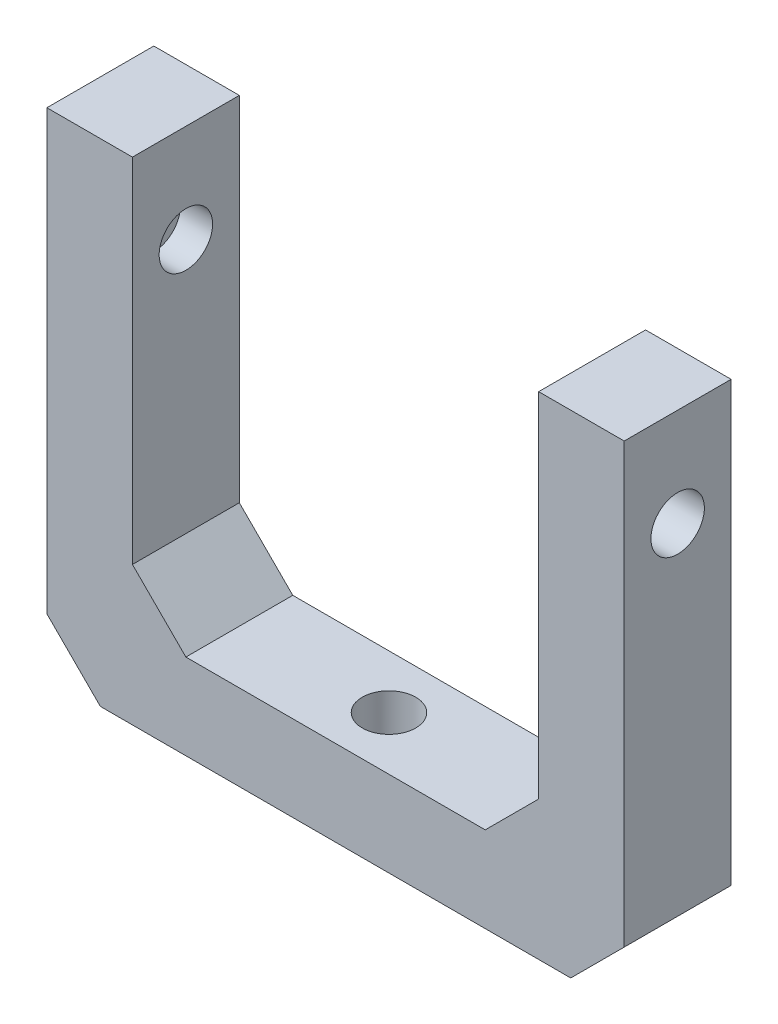
ISO-10303-21;
HEADER;
FILE_DESCRIPTION(('STEP AP214'),'2;1');
FILE_NAME('part.step','',(''),(''),'','','');
FILE_SCHEMA(('AUTOMOTIVE_DESIGN { 1 0 10303 214 1 1 1 1 }'));
ENDSEC;
DATA;
#1=APPLICATION_CONTEXT('core data for automotive mechanical design processes');
#2=APPLICATION_PROTOCOL_DEFINITION('international standard','automotive_design',2000,#1);
#3=PRODUCT_CONTEXT('',#1,'mechanical');
#4=PRODUCT('Part','Part','',(#3));
#5=PRODUCT_RELATED_PRODUCT_CATEGORY('part','',(#4));
#6=PRODUCT_DEFINITION_FORMATION('','',#4);
#7=PRODUCT_DEFINITION_CONTEXT('part definition',#1,'design');
#8=PRODUCT_DEFINITION('design','',#6,#7);
#9=PRODUCT_DEFINITION_SHAPE('','',#8);
#10=(LENGTH_UNIT() NAMED_UNIT(*) SI_UNIT(.MILLI.,.METRE.));
#11=(NAMED_UNIT(*) PLANE_ANGLE_UNIT() SI_UNIT($,.RADIAN.));
#12=(NAMED_UNIT(*) SI_UNIT($,.STERADIAN.) SOLID_ANGLE_UNIT());
#13=UNCERTAINTY_MEASURE_WITH_UNIT(LENGTH_MEASURE(1.E-05),#10,'distance_accuracy_value','');
#14=(GEOMETRIC_REPRESENTATION_CONTEXT(3) GLOBAL_UNCERTAINTY_ASSIGNED_CONTEXT((#13)) GLOBAL_UNIT_ASSIGNED_CONTEXT((#10,
#11,#12)) REPRESENTATION_CONTEXT('',''));
#15=CARTESIAN_POINT('',(0.,0.,0.));
#16=DIRECTION('',(0.,0.,1.));
#17=DIRECTION('',(1.,0.,0.));
#18=AXIS2_PLACEMENT_3D('',#15,#16,#17);
#19=CARTESIAN_POINT('',(0.,38.001,5.));
#20=DIRECTION('',(0.,-1.,0.));
#21=DIRECTION('',(1.,0.,0.));
#22=AXIS2_PLACEMENT_3D('',#19,#20,#21);
#23=CYLINDRICAL_SURFACE('',#22,2.5);
#24=CARTESIAN_POINT('',(0.,0.,5.));
#25=DIRECTION('',(0.,-1.,0.));
#26=DIRECTION('',(0.,0.,-1.));
#27=AXIS2_PLACEMENT_3D('',#24,#25,#26);
#28=CIRCLE('',#27,2.5);
#29=CARTESIAN_POINT('',(0.,0.,2.5));
#30=VERTEX_POINT('',#29);
#31=EDGE_CURVE('E235',#30,#30,#28,.F.);
#32=ORIENTED_EDGE('',*,*,#31,.T.);
#33=EDGE_LOOP('',(#32));
#34=FACE_BOUND('',#33,.T.);
#35=CARTESIAN_POINT('',(0.,-4.,5.));
#36=DIRECTION('',(0.,-1.,0.));
#37=DIRECTION('',(1.,0.,0.));
#38=AXIS2_PLACEMENT_3D('',#35,#36,#37);
#39=CIRCLE('',#38,2.5);
#40=CARTESIAN_POINT('',(2.5,-4.,5.));
#41=VERTEX_POINT('',#40);
#42=EDGE_CURVE('E48',#41,#41,#39,.F.);
#43=ORIENTED_EDGE('',*,*,#42,.F.);
#44=EDGE_LOOP('',(#43));
#45=FACE_BOUND('',#44,.T.);
#46=ADVANCED_FACE('F44',(#34,#45),#23,.F.);
#47=CARTESIAN_POINT('',(27.001,28.83,5.));
#48=DIRECTION('',(-1.,0.,0.));
#49=DIRECTION('',(0.,-1.,0.));
#50=AXIS2_PLACEMENT_3D('',#47,#48,#49);
#51=CYLINDRICAL_SURFACE('',#50,2.5);
#52=CARTESIAN_POINT('',(27.,28.83,5.));
#53=DIRECTION('',(-1.,0.,0.));
#54=DIRECTION('',(0.,-1.,0.));
#55=AXIS2_PLACEMENT_3D('',#52,#53,#54);
#56=CIRCLE('',#55,2.5);
#57=CARTESIAN_POINT('',(27.,26.33,5.));
#58=VERTEX_POINT('',#57);
#59=EDGE_CURVE('E282',#58,#58,#56,.T.);
#60=ORIENTED_EDGE('',*,*,#59,.F.);
#61=EDGE_LOOP('',(#60));
#62=FACE_BOUND('',#61,.T.);
#63=CARTESIAN_POINT('',(22.,28.83,5.));
#64=DIRECTION('',(-1.,0.,0.));
#65=DIRECTION('',(0.,-1.,0.));
#66=AXIS2_PLACEMENT_3D('',#63,#64,#65);
#67=CIRCLE('',#66,2.5);
#68=CARTESIAN_POINT('',(22.,26.33,5.));
#69=VERTEX_POINT('',#68);
#70=EDGE_CURVE('E273',#69,#69,#67,.T.);
#71=ORIENTED_EDGE('',*,*,#70,.T.);
#72=EDGE_LOOP('',(#71));
#73=FACE_BOUND('',#72,.T.);
#74=ADVANCED_FACE('F414',(#62,#73),#51,.F.);
#75=CARTESIAN_POINT('',(-27.,-3.00000000000001,10.));
#76=DIRECTION('',(1.,0.,0.));
#77=DIRECTION('',(0.,1.,0.));
#78=AXIS2_PLACEMENT_3D('',#75,#76,#77);
#79=PLANE('',#78);
#80=DIRECTION('',(0.,-1.,0.));
#81=VECTOR('',#80,1.);
#82=CARTESIAN_POINT('',(-27.,-3.00000000000001,0.));
#83=LINE('',#82,#81);
#84=CARTESIAN_POINT('',(-27.,38.,0.));
#85=VERTEX_POINT('',#84);
#86=CARTESIAN_POINT('',(-27.,-3.00000000000001,0.));
#87=VERTEX_POINT('',#86);
#88=EDGE_CURVE('E286',#85,#87,#83,.T.);
#89=ORIENTED_EDGE('',*,*,#88,.T.);
#90=DIRECTION('',(0.,0.,-1.));
#91=VECTOR('',#90,1.);
#92=CARTESIAN_POINT('',(-27.,-3.00000000000001,10.));
#93=LINE('',#92,#91);
#94=CARTESIAN_POINT('',(-27.,-3.00000000000001,10.));
#95=VERTEX_POINT('',#94);
#96=EDGE_CURVE('E11',#95,#87,#93,.T.);
#97=ORIENTED_EDGE('',*,*,#96,.F.);
#98=DIRECTION('',(0.,-1.,0.));
#99=VECTOR('',#98,1.);
#100=CARTESIAN_POINT('',(-27.,-3.00000000000001,10.));
#101=LINE('',#100,#99);
#102=CARTESIAN_POINT('',(-27.,38.,10.));
#103=VERTEX_POINT('',#102);
#104=EDGE_CURVE('E295',#103,#95,#101,.T.);
#105=ORIENTED_EDGE('',*,*,#104,.F.);
#106=DIRECTION('',(0.,0.,-1.));
#107=VECTOR('',#106,1.);
#108=CARTESIAN_POINT('',(-27.,38.,10.));
#109=LINE('',#108,#107);
#110=EDGE_CURVE('E333',#103,#85,#109,.T.);
#111=ORIENTED_EDGE('',*,*,#110,.T.);
#112=EDGE_LOOP('',(#89,#97,#105,#111));
#113=FACE_BOUND('',#112,.T.);
#114=ADVANCED_FACE('F46',(#113),#79,.F.);
#115=CARTESIAN_POINT('',(-22.,-8.00000000000001,10.));
#116=DIRECTION('',(0.707106781186547,0.707106781186548,0.));
#117=DIRECTION('',(-0.707106781186548,0.707106781186547,0.));
#118=AXIS2_PLACEMENT_3D('',#115,#116,#117);
#119=PLANE('',#118);
#120=DIRECTION('',(0.707106781186548,-0.707106781186547,0.));
#121=VECTOR('',#120,1.);
#122=CARTESIAN_POINT('',(-22.,-8.00000000000001,0.));
#123=LINE('',#122,#121);
#124=CARTESIAN_POINT('',(-22.,-8.00000000000001,0.));
#125=VERTEX_POINT('',#124);
#126=EDGE_CURVE('E337',#87,#125,#123,.T.);
#127=ORIENTED_EDGE('',*,*,#126,.T.);
#128=DIRECTION('',(0.,0.,-1.));
#129=VECTOR('',#128,1.);
#130=CARTESIAN_POINT('',(-22.,-8.00000000000001,10.));
#131=LINE('',#130,#129);
#132=CARTESIAN_POINT('',(-22.,-8.00000000000001,10.));
#133=VERTEX_POINT('',#132);
#134=EDGE_CURVE('E54',#133,#125,#131,.T.);
#135=ORIENTED_EDGE('',*,*,#134,.F.);
#136=DIRECTION('',(0.707106781186548,-0.707106781186547,0.));
#137=VECTOR('',#136,1.);
#138=CARTESIAN_POINT('',(-22.,-8.00000000000001,10.));
#139=LINE('',#138,#137);
#140=EDGE_CURVE('E299',#95,#133,#139,.T.);
#141=ORIENTED_EDGE('',*,*,#140,.F.);
#142=ORIENTED_EDGE('',*,*,#96,.T.);
#143=EDGE_LOOP('',(#127,#135,#141,#142));
#144=FACE_BOUND('',#143,.T.);
#145=ADVANCED_FACE('F489',(#144),#119,.F.);
#146=CARTESIAN_POINT('',(22.,-7.99999999999999,10.));
#147=DIRECTION('',(0.,1.,0.));
#148=DIRECTION('',(-1.,0.,0.));
#149=AXIS2_PLACEMENT_3D('',#146,#147,#148);
#150=PLANE('',#149);
#151=DIRECTION('',(-1.,0.,0.));
#152=VECTOR('',#151,1.);
#153=CARTESIAN_POINT('',(-19.,-8.00000000000001,8.5));
#154=LINE('',#153,#152);
#155=CARTESIAN_POINT('',(19.,-7.99999999999999,8.5));
#156=VERTEX_POINT('',#155);
#157=CARTESIAN_POINT('',(-19.,-8.00000000000001,8.5));
#158=VERTEX_POINT('',#157);
#159=EDGE_CURVE('E221',#156,#158,#154,.T.);
#160=ORIENTED_EDGE('',*,*,#159,.F.);
#161=DIRECTION('',(0.,0.,1.));
#162=VECTOR('',#161,1.);
#163=CARTESIAN_POINT('',(19.,-7.99999999999999,8.5));
#164=LINE('',#163,#162);
#165=CARTESIAN_POINT('',(19.,-7.99999999999999,1.5));
#166=VERTEX_POINT('',#165);
#167=EDGE_CURVE('E62',#166,#156,#164,.T.);
#168=ORIENTED_EDGE('',*,*,#167,.F.);
#169=DIRECTION('',(1.,0.,0.));
#170=VECTOR('',#169,1.);
#171=CARTESIAN_POINT('',(-19.,-8.00000000000001,1.5));
#172=LINE('',#171,#170);
#173=CARTESIAN_POINT('',(-19.,-8.00000000000001,1.5));
#174=VERTEX_POINT('',#173);
#175=EDGE_CURVE('E208',#174,#166,#172,.T.);
#176=ORIENTED_EDGE('',*,*,#175,.F.);
#177=DIRECTION('',(0.,0.,-1.));
#178=VECTOR('',#177,1.);
#179=CARTESIAN_POINT('',(-19.,-8.00000000000001,8.5));
#180=LINE('',#179,#178);
#181=EDGE_CURVE('E212',#158,#174,#180,.T.);
#182=ORIENTED_EDGE('',*,*,#181,.F.);
#183=EDGE_LOOP('',(#160,#168,#176,#182));
#184=FACE_BOUND('',#183,.T.);
#185=DIRECTION('',(1.,0.,0.));
#186=VECTOR('',#185,1.);
#187=CARTESIAN_POINT('',(22.,-7.99999999999999,0.));
#188=LINE('',#187,#186);
#189=CARTESIAN_POINT('',(22.,-7.99999999999999,0.));
#190=VERTEX_POINT('',#189);
#191=EDGE_CURVE('E340',#125,#190,#188,.T.);
#192=ORIENTED_EDGE('',*,*,#191,.T.);
#193=DIRECTION('',(0.,0.,-1.));
#194=VECTOR('',#193,1.);
#195=CARTESIAN_POINT('',(22.,-7.99999999999999,10.));
#196=LINE('',#195,#194);
#197=CARTESIAN_POINT('',(22.,-7.99999999999999,10.));
#198=VERTEX_POINT('',#197);
#199=EDGE_CURVE('E404',#198,#190,#196,.T.);
#200=ORIENTED_EDGE('',*,*,#199,.F.);
#201=DIRECTION('',(1.,0.,0.));
#202=VECTOR('',#201,1.);
#203=CARTESIAN_POINT('',(22.,-7.99999999999999,10.));
#204=LINE('',#203,#202);
#205=EDGE_CURVE('E303',#133,#198,#204,.T.);
#206=ORIENTED_EDGE('',*,*,#205,.F.);
#207=ORIENTED_EDGE('',*,*,#134,.T.);
#208=EDGE_LOOP('',(#192,#200,#206,#207));
#209=FACE_BOUND('',#208,.T.);
#210=ADVANCED_FACE('F484',(#184,#209),#150,.F.);
#211=CARTESIAN_POINT('',(27.,-2.99999999999999,10.));
#212=DIRECTION('',(-0.707106781186548,0.707106781186547,0.));
#213=DIRECTION('',(-0.707106781186547,-0.707106781186548,0.));
#214=AXIS2_PLACEMENT_3D('',#211,#212,#213);
#215=PLANE('',#214);
#216=DIRECTION('',(0.707106781186547,0.707106781186548,0.));
#217=VECTOR('',#216,1.);
#218=CARTESIAN_POINT('',(27.,-2.99999999999999,0.));
#219=LINE('',#218,#217);
#220=CARTESIAN_POINT('',(27.,-2.99999999999999,0.));
#221=VERTEX_POINT('',#220);
#222=EDGE_CURVE('E343',#190,#221,#219,.T.);
#223=ORIENTED_EDGE('',*,*,#222,.T.);
#224=DIRECTION('',(0.,0.,-1.));
#225=VECTOR('',#224,1.);
#226=CARTESIAN_POINT('',(27.,-2.99999999999999,10.));
#227=LINE('',#226,#225);
#228=CARTESIAN_POINT('',(27.,-2.99999999999999,10.));
#229=VERTEX_POINT('',#228);
#230=EDGE_CURVE('E400',#229,#221,#227,.T.);
#231=ORIENTED_EDGE('',*,*,#230,.F.);
#232=DIRECTION('',(0.707106781186547,0.707106781186548,0.));
#233=VECTOR('',#232,1.);
#234=CARTESIAN_POINT('',(27.,-2.99999999999999,10.));
#235=LINE('',#234,#233);
#236=EDGE_CURVE('E306',#198,#229,#235,.T.);
#237=ORIENTED_EDGE('',*,*,#236,.F.);
#238=ORIENTED_EDGE('',*,*,#199,.T.);
#239=EDGE_LOOP('',(#223,#231,#237,#238));
#240=FACE_BOUND('',#239,.T.);
#241=ADVANCED_FACE('F480',(#240),#215,.F.);
#242=CARTESIAN_POINT('',(27.,38.,10.));
#243=DIRECTION('',(-1.,0.,0.));
#244=DIRECTION('',(0.,-1.,0.));
#245=AXIS2_PLACEMENT_3D('',#242,#243,#244);
#246=PLANE('',#245);
#247=ORIENTED_EDGE('',*,*,#59,.T.);
#248=EDGE_LOOP('',(#247));
#249=FACE_BOUND('',#248,.T.);
#250=DIRECTION('',(0.,1.,0.));
#251=VECTOR('',#250,1.);
#252=CARTESIAN_POINT('',(27.,38.,0.));
#253=LINE('',#252,#251);
#254=CARTESIAN_POINT('',(27.,38.,0.));
#255=VERTEX_POINT('',#254);
#256=EDGE_CURVE('E346',#221,#255,#253,.T.);
#257=ORIENTED_EDGE('',*,*,#256,.T.);
#258=DIRECTION('',(0.,0.,-1.));
#259=VECTOR('',#258,1.);
#260=CARTESIAN_POINT('',(27.,38.,10.));
#261=LINE('',#260,#259);
#262=CARTESIAN_POINT('',(27.,38.,10.));
#263=VERTEX_POINT('',#262);
#264=EDGE_CURVE('E396',#263,#255,#261,.T.);
#265=ORIENTED_EDGE('',*,*,#264,.F.);
#266=DIRECTION('',(0.,1.,0.));
#267=VECTOR('',#266,1.);
#268=CARTESIAN_POINT('',(27.,38.,10.));
#269=LINE('',#268,#267);
#270=EDGE_CURVE('E309',#229,#263,#269,.T.);
#271=ORIENTED_EDGE('',*,*,#270,.F.);
#272=ORIENTED_EDGE('',*,*,#230,.T.);
#273=EDGE_LOOP('',(#257,#265,#271,#272));
#274=FACE_BOUND('',#273,.T.);
#275=ADVANCED_FACE('F476',(#249,#274),#246,.F.);
#276=CARTESIAN_POINT('',(19.,38.,10.));
#277=DIRECTION('',(0.,-1.,0.));
#278=DIRECTION('',(1.,0.,0.));
#279=AXIS2_PLACEMENT_3D('',#276,#277,#278);
#280=PLANE('',#279);
#281=DIRECTION('',(-1.,0.,0.));
#282=VECTOR('',#281,1.);
#283=CARTESIAN_POINT('',(19.,38.,0.));
#284=LINE('',#283,#282);
#285=CARTESIAN_POINT('',(19.,38.,0.));
#286=VERTEX_POINT('',#285);
#287=EDGE_CURVE('E349',#255,#286,#284,.T.);
#288=ORIENTED_EDGE('',*,*,#287,.T.);
#289=DIRECTION('',(0.,0.,-1.));
#290=VECTOR('',#289,1.);
#291=CARTESIAN_POINT('',(19.,38.,10.));
#292=LINE('',#291,#290);
#293=CARTESIAN_POINT('',(19.,38.,10.));
#294=VERTEX_POINT('',#293);
#295=EDGE_CURVE('E392',#294,#286,#292,.T.);
#296=ORIENTED_EDGE('',*,*,#295,.F.);
#297=DIRECTION('',(-1.,0.,0.));
#298=VECTOR('',#297,1.);
#299=CARTESIAN_POINT('',(19.,38.,10.));
#300=LINE('',#299,#298);
#301=EDGE_CURVE('E312',#263,#294,#300,.T.);
#302=ORIENTED_EDGE('',*,*,#301,.F.);
#303=ORIENTED_EDGE('',*,*,#264,.T.);
#304=EDGE_LOOP('',(#288,#296,#302,#303));
#305=FACE_BOUND('',#304,.T.);
#306=ADVANCED_FACE('F439',(#305),#280,.F.);
#307=CARTESIAN_POINT('',(19.,5.,10.));
#308=DIRECTION('',(1.,0.,0.));
#309=DIRECTION('',(0.,1.,0.));
#310=AXIS2_PLACEMENT_3D('',#307,#308,#309);
#311=PLANE('',#310);
#312=DIRECTION('',(0.,-1.,0.));
#313=VECTOR('',#312,1.);
#314=CARTESIAN_POINT('',(19.,28.5035754465637,1.50000000000002));
#315=LINE('',#314,#313);
#316=CARTESIAN_POINT('',(19.,28.5035754465637,1.50000000000002));
#317=VERTEX_POINT('',#316);
#318=CARTESIAN_POINT('',(19.,16.5035754465637,1.50000000000001));
#319=VERTEX_POINT('',#318);
#320=EDGE_CURVE('E259',#317,#319,#315,.T.);
#321=ORIENTED_EDGE('',*,*,#320,.F.);
#322=CARTESIAN_POINT('',(19.,28.5035754465637,5.00000000000001));
#323=DIRECTION('',(-1.,0.,0.));
#324=DIRECTION('',(0.,-1.,0.));
#325=AXIS2_PLACEMENT_3D('',#322,#323,#324);
#326=CIRCLE('',#325,3.49999999999998);
#327=CARTESIAN_POINT('',(19.,28.5035754465637,8.49999999999998));
#328=VERTEX_POINT('',#327);
#329=EDGE_CURVE('E70',#328,#317,#326,.T.);
#330=ORIENTED_EDGE('',*,*,#329,.F.);
#331=DIRECTION('',(0.,1.,0.));
#332=VECTOR('',#331,1.);
#333=CARTESIAN_POINT('',(19.,28.5035754465637,8.49999999999998));
#334=LINE('',#333,#332);
#335=CARTESIAN_POINT('',(19.,16.5035754465637,8.49999999999999));
#336=VERTEX_POINT('',#335);
#337=EDGE_CURVE('E244',#336,#328,#334,.T.);
#338=ORIENTED_EDGE('',*,*,#337,.F.);
#339=CARTESIAN_POINT('',(19.,16.5035754465637,5.));
#340=DIRECTION('',(-1.,0.,0.));
#341=DIRECTION('',(0.,-1.,0.));
#342=AXIS2_PLACEMENT_3D('',#339,#340,#341);
#343=CIRCLE('',#342,3.49999999999999);
#344=EDGE_CURVE('E263',#319,#336,#343,.T.);
#345=ORIENTED_EDGE('',*,*,#344,.F.);
#346=EDGE_LOOP('',(#321,#330,#338,#345));
#347=FACE_BOUND('',#346,.T.);
#348=DIRECTION('',(0.,-1.,0.));
#349=VECTOR('',#348,1.);
#350=CARTESIAN_POINT('',(19.,5.,0.));
#351=LINE('',#350,#349);
#352=CARTESIAN_POINT('',(19.,5.,0.));
#353=VERTEX_POINT('',#352);
#354=EDGE_CURVE('E352',#286,#353,#351,.T.);
#355=ORIENTED_EDGE('',*,*,#354,.T.);
#356=DIRECTION('',(0.,0.,-1.));
#357=VECTOR('',#356,1.);
#358=CARTESIAN_POINT('',(19.,5.,10.));
#359=LINE('',#358,#357);
#360=CARTESIAN_POINT('',(19.,5.,10.));
#361=VERTEX_POINT('',#360);
#362=EDGE_CURVE('E388',#361,#353,#359,.T.);
#363=ORIENTED_EDGE('',*,*,#362,.F.);
#364=DIRECTION('',(0.,-1.,0.));
#365=VECTOR('',#364,1.);
#366=CARTESIAN_POINT('',(19.,5.,10.));
#367=LINE('',#366,#365);
#368=EDGE_CURVE('E315',#294,#361,#367,.T.);
#369=ORIENTED_EDGE('',*,*,#368,.F.);
#370=ORIENTED_EDGE('',*,*,#295,.T.);
#371=EDGE_LOOP('',(#355,#363,#369,#370));
#372=FACE_BOUND('',#371,.T.);
#373=ADVANCED_FACE('F435',(#347,#372),#311,.F.);
#374=CARTESIAN_POINT('',(14.,0.,10.));
#375=DIRECTION('',(0.707106781186547,-0.707106781186548,0.));
#376=DIRECTION('',(0.707106781186548,0.707106781186547,0.));
#377=AXIS2_PLACEMENT_3D('',#374,#375,#376);
#378=PLANE('',#377);
#379=DIRECTION('',(-0.707106781186548,-0.707106781186547,0.));
#380=VECTOR('',#379,1.);
#381=CARTESIAN_POINT('',(14.,0.,0.));
#382=LINE('',#381,#380);
#383=CARTESIAN_POINT('',(14.,0.,0.));
#384=VERTEX_POINT('',#383);
#385=EDGE_CURVE('E355',#353,#384,#382,.T.);
#386=ORIENTED_EDGE('',*,*,#385,.T.);
#387=DIRECTION('',(0.,0.,-1.));
#388=VECTOR('',#387,1.);
#389=CARTESIAN_POINT('',(14.,0.,10.));
#390=LINE('',#389,#388);
#391=CARTESIAN_POINT('',(14.,0.,10.));
#392=VERTEX_POINT('',#391);
#393=EDGE_CURVE('E384',#392,#384,#390,.T.);
#394=ORIENTED_EDGE('',*,*,#393,.F.);
#395=DIRECTION('',(-0.707106781186548,-0.707106781186547,0.));
#396=VECTOR('',#395,1.);
#397=CARTESIAN_POINT('',(14.,0.,10.));
#398=LINE('',#397,#396);
#399=EDGE_CURVE('E318',#361,#392,#398,.T.);
#400=ORIENTED_EDGE('',*,*,#399,.F.);
#401=ORIENTED_EDGE('',*,*,#362,.T.);
#402=EDGE_LOOP('',(#386,#394,#400,#401));
#403=FACE_BOUND('',#402,.T.);
#404=ADVANCED_FACE('F438',(#403),#378,.F.);
#405=CARTESIAN_POINT('',(-14.,0.,10.));
#406=DIRECTION('',(0.,-1.,0.));
#407=DIRECTION('',(0.,0.,-1.));
#408=AXIS2_PLACEMENT_3D('',#405,#406,#407);
#409=PLANE('',#408);
#410=ORIENTED_EDGE('',*,*,#31,.F.);
#411=EDGE_LOOP('',(#410));
#412=FACE_BOUND('',#411,.T.);
#413=DIRECTION('',(-1.,0.,0.));
#414=VECTOR('',#413,1.);
#415=CARTESIAN_POINT('',(-14.,0.,0.));
#416=LINE('',#415,#414);
#417=CARTESIAN_POINT('',(-14.,0.,0.));
#418=VERTEX_POINT('',#417);
#419=EDGE_CURVE('E358',#384,#418,#416,.T.);
#420=ORIENTED_EDGE('',*,*,#419,.T.);
#421=DIRECTION('',(0.,0.,-1.));
#422=VECTOR('',#421,1.);
#423=CARTESIAN_POINT('',(-14.,0.,10.));
#424=LINE('',#423,#422);
#425=CARTESIAN_POINT('',(-14.,0.,10.));
#426=VERTEX_POINT('',#425);
#427=EDGE_CURVE('E380',#426,#418,#424,.T.);
#428=ORIENTED_EDGE('',*,*,#427,.F.);
#429=DIRECTION('',(-1.,0.,0.));
#430=VECTOR('',#429,1.);
#431=CARTESIAN_POINT('',(-14.,0.,10.));
#432=LINE('',#431,#430);
#433=EDGE_CURVE('E321',#392,#426,#432,.T.);
#434=ORIENTED_EDGE('',*,*,#433,.F.);
#435=ORIENTED_EDGE('',*,*,#393,.T.);
#436=EDGE_LOOP('',(#420,#428,#434,#435));
#437=FACE_BOUND('',#436,.T.);
#438=ADVANCED_FACE('F458',(#412,#437),#409,.F.);
#439=CARTESIAN_POINT('',(-19.,5.,10.));
#440=DIRECTION('',(-0.707106781186547,-0.707106781186548,0.));
#441=DIRECTION('',(0.707106781186548,-0.707106781186547,0.));
#442=AXIS2_PLACEMENT_3D('',#439,#440,#441);
#443=PLANE('',#442);
#444=DIRECTION('',(-0.707106781186548,0.707106781186547,0.));
#445=VECTOR('',#444,1.);
#446=CARTESIAN_POINT('',(-19.,5.,0.));
#447=LINE('',#446,#445);
#448=CARTESIAN_POINT('',(-19.,5.,0.));
#449=VERTEX_POINT('',#448);
#450=EDGE_CURVE('E361',#418,#449,#447,.T.);
#451=ORIENTED_EDGE('',*,*,#450,.T.);
#452=DIRECTION('',(0.,0.,-1.));
#453=VECTOR('',#452,1.);
#454=CARTESIAN_POINT('',(-19.,5.,10.));
#455=LINE('',#454,#453);
#456=CARTESIAN_POINT('',(-19.,5.,10.));
#457=VERTEX_POINT('',#456);
#458=EDGE_CURVE('E376',#457,#449,#455,.T.);
#459=ORIENTED_EDGE('',*,*,#458,.F.);
#460=DIRECTION('',(-0.707106781186548,0.707106781186547,0.));
#461=VECTOR('',#460,1.);
#462=CARTESIAN_POINT('',(-19.,5.,10.));
#463=LINE('',#462,#461);
#464=EDGE_CURVE('E324',#426,#457,#463,.T.);
#465=ORIENTED_EDGE('',*,*,#464,.F.);
#466=ORIENTED_EDGE('',*,*,#427,.T.);
#467=EDGE_LOOP('',(#451,#459,#465,#466));
#468=FACE_BOUND('',#467,.T.);
#469=ADVANCED_FACE('F462',(#468),#443,.F.);
#470=CARTESIAN_POINT('',(-19.,38.,10.));
#471=DIRECTION('',(-1.,0.,0.));
#472=DIRECTION('',(0.,-1.,0.));
#473=AXIS2_PLACEMENT_3D('',#470,#471,#472);
#474=PLANE('',#473);
#475=CARTESIAN_POINT('',(-19.,28.83,5.));
#476=DIRECTION('',(1.,0.,0.));
#477=DIRECTION('',(0.,1.,0.));
#478=AXIS2_PLACEMENT_3D('',#475,#476,#477);
#479=CIRCLE('',#478,2.5);
#480=CARTESIAN_POINT('',(-19.,31.33,5.));
#481=VERTEX_POINT('',#480);
#482=EDGE_CURVE('E287',#481,#481,#479,.T.);
#483=ORIENTED_EDGE('',*,*,#482,.F.);
#484=EDGE_LOOP('',(#483));
#485=FACE_BOUND('',#484,.T.);
#486=DIRECTION('',(0.,1.,0.));
#487=VECTOR('',#486,1.);
#488=CARTESIAN_POINT('',(-19.,38.,0.));
#489=LINE('',#488,#487);
#490=CARTESIAN_POINT('',(-19.,38.,0.));
#491=VERTEX_POINT('',#490);
#492=EDGE_CURVE('E364',#449,#491,#489,.T.);
#493=ORIENTED_EDGE('',*,*,#492,.T.);
#494=DIRECTION('',(0.,0.,-1.));
#495=VECTOR('',#494,1.);
#496=CARTESIAN_POINT('',(-19.,38.,10.));
#497=LINE('',#496,#495);
#498=CARTESIAN_POINT('',(-19.,38.,10.));
#499=VERTEX_POINT('',#498);
#500=EDGE_CURVE('E372',#499,#491,#497,.T.);
#501=ORIENTED_EDGE('',*,*,#500,.F.);
#502=DIRECTION('',(0.,1.,0.));
#503=VECTOR('',#502,1.);
#504=CARTESIAN_POINT('',(-19.,38.,10.));
#505=LINE('',#504,#503);
#506=EDGE_CURVE('E327',#457,#499,#505,.T.);
#507=ORIENTED_EDGE('',*,*,#506,.F.);
#508=ORIENTED_EDGE('',*,*,#458,.T.);
#509=EDGE_LOOP('',(#493,#501,#507,#508));
#510=FACE_BOUND('',#509,.T.);
#511=ADVANCED_FACE('F497',(#485,#510),#474,.F.);
#512=CARTESIAN_POINT('',(-27.,38.,10.));
#513=DIRECTION('',(0.,-1.,0.));
#514=DIRECTION('',(0.,0.,-1.));
#515=AXIS2_PLACEMENT_3D('',#512,#513,#514);
#516=PLANE('',#515);
#517=DIRECTION('',(-1.,0.,0.));
#518=VECTOR('',#517,1.);
#519=CARTESIAN_POINT('',(-27.,38.,0.));
#520=LINE('',#519,#518);
#521=EDGE_CURVE('E300',#491,#85,#520,.T.);
#522=ORIENTED_EDGE('',*,*,#521,.T.);
#523=ORIENTED_EDGE('',*,*,#110,.F.);
#524=DIRECTION('',(-1.,0.,0.));
#525=VECTOR('',#524,1.);
#526=CARTESIAN_POINT('',(-27.,38.,10.));
#527=LINE('',#526,#525);
#528=EDGE_CURVE('E330',#499,#103,#527,.T.);
#529=ORIENTED_EDGE('',*,*,#528,.F.);
#530=ORIENTED_EDGE('',*,*,#500,.T.);
#531=EDGE_LOOP('',(#522,#523,#529,#530));
#532=FACE_BOUND('',#531,.T.);
#533=ADVANCED_FACE('F495',(#532),#516,.F.);
#534=CARTESIAN_POINT('',(0.,0.,10.));
#535=DIRECTION('',(0.,0.,-1.));
#536=DIRECTION('',(-1.,0.,0.));
#537=AXIS2_PLACEMENT_3D('',#534,#535,#536);
#538=PLANE('',#537);
#539=ORIENTED_EDGE('',*,*,#104,.T.);
#540=ORIENTED_EDGE('',*,*,#140,.T.);
#541=ORIENTED_EDGE('',*,*,#205,.T.);
#542=ORIENTED_EDGE('',*,*,#236,.T.);
#543=ORIENTED_EDGE('',*,*,#270,.T.);
#544=ORIENTED_EDGE('',*,*,#301,.T.);
#545=ORIENTED_EDGE('',*,*,#368,.T.);
#546=ORIENTED_EDGE('',*,*,#399,.T.);
#547=ORIENTED_EDGE('',*,*,#433,.T.);
#548=ORIENTED_EDGE('',*,*,#464,.T.);
#549=ORIENTED_EDGE('',*,*,#506,.T.);
#550=ORIENTED_EDGE('',*,*,#528,.T.);
#551=EDGE_LOOP('',(#539,#540,#541,#542,#543,#544,#545,#546,#547,#548,#549,#550));
#552=FACE_BOUND('',#551,.T.);
#553=ADVANCED_FACE('F466',(#552),#538,.F.);
#554=CARTESIAN_POINT('',(0.,0.,0.));
#555=DIRECTION('',(0.,0.,-1.));
#556=DIRECTION('',(-1.,0.,0.));
#557=AXIS2_PLACEMENT_3D('',#554,#555,#556);
#558=PLANE('',#557);
#559=ORIENTED_EDGE('',*,*,#88,.F.);
#560=ORIENTED_EDGE('',*,*,#521,.F.);
#561=ORIENTED_EDGE('',*,*,#492,.F.);
#562=ORIENTED_EDGE('',*,*,#450,.F.);
#563=ORIENTED_EDGE('',*,*,#419,.F.);
#564=ORIENTED_EDGE('',*,*,#385,.F.);
#565=ORIENTED_EDGE('',*,*,#354,.F.);
#566=ORIENTED_EDGE('',*,*,#287,.F.);
#567=ORIENTED_EDGE('',*,*,#256,.F.);
#568=ORIENTED_EDGE('',*,*,#222,.F.);
#569=ORIENTED_EDGE('',*,*,#191,.F.);
#570=ORIENTED_EDGE('',*,*,#126,.F.);
#571=EDGE_LOOP('',(#559,#560,#561,#562,#563,#564,#565,#566,#567,#568,#569,#570));
#572=FACE_BOUND('',#571,.T.);
#573=ADVANCED_FACE('F453',(#572),#558,.T.);
#574=CARTESIAN_POINT('',(-22.,28.83,5.));
#575=DIRECTION('',(1.,0.,0.));
#576=DIRECTION('',(0.,1.,0.));
#577=AXIS2_PLACEMENT_3D('',#574,#575,#576);
#578=CYLINDRICAL_SURFACE('',#577,2.5);
#579=CARTESIAN_POINT('',(-22.,28.83,5.));
#580=DIRECTION('',(1.,0.,0.));
#581=DIRECTION('',(0.,1.,0.));
#582=AXIS2_PLACEMENT_3D('',#579,#580,#581);
#583=CIRCLE('',#582,2.5);
#584=CARTESIAN_POINT('',(-22.,31.33,5.));
#585=VERTEX_POINT('',#584);
#586=EDGE_CURVE('E291',#585,#585,#583,.T.);
#587=ORIENTED_EDGE('',*,*,#586,.F.);
#588=EDGE_LOOP('',(#587));
#589=FACE_BOUND('',#588,.T.);
#590=ORIENTED_EDGE('',*,*,#482,.T.);
#591=EDGE_LOOP('',(#590));
#592=FACE_BOUND('',#591,.T.);
#593=ADVANCED_FACE('F529',(#589,#592),#578,.F.);
#594=CARTESIAN_POINT('',(-22.,28.83,5.));
#595=DIRECTION('',(1.,0.,0.));
#596=DIRECTION('',(0.,1.,0.));
#597=AXIS2_PLACEMENT_3D('',#594,#595,#596);
#598=PLANE('',#597);
#599=ORIENTED_EDGE('',*,*,#586,.T.);
#600=EDGE_LOOP('',(#599));
#601=FACE_BOUND('',#600,.T.);
#602=ADVANCED_FACE('F527',(#601),#598,.T.);
#603=CARTESIAN_POINT('',(22.,28.5035754465637,5.00000000000001));
#604=DIRECTION('',(-1.,0.,0.));
#605=DIRECTION('',(0.,-1.,0.));
#606=AXIS2_PLACEMENT_3D('',#603,#604,#605);
#607=CYLINDRICAL_SURFACE('',#606,3.49999999999998);
#608=ORIENTED_EDGE('',*,*,#329,.T.);
#609=DIRECTION('',(-1.,0.,0.));
#610=VECTOR('',#609,1.);
#611=CARTESIAN_POINT('',(22.,28.5035754465637,1.50000000000002));
#612=LINE('',#611,#610);
#613=CARTESIAN_POINT('',(22.,28.5035754465637,1.50000000000002));
#614=VERTEX_POINT('',#613);
#615=EDGE_CURVE('E256',#614,#317,#612,.T.);
#616=ORIENTED_EDGE('',*,*,#615,.F.);
#617=CARTESIAN_POINT('',(22.,28.5035754465637,5.00000000000001));
#618=DIRECTION('',(-1.,0.,0.));
#619=DIRECTION('',(0.,-1.,0.));
#620=AXIS2_PLACEMENT_3D('',#617,#618,#619);
#621=CIRCLE('',#620,3.49999999999998);
#622=CARTESIAN_POINT('',(22.,28.5035754465637,8.49999999999998));
#623=VERTEX_POINT('',#622);
#624=EDGE_CURVE('E239',#623,#614,#621,.T.);
#625=ORIENTED_EDGE('',*,*,#624,.F.);
#626=DIRECTION('',(-1.,0.,0.));
#627=VECTOR('',#626,1.);
#628=CARTESIAN_POINT('',(22.,28.5035754465637,8.49999999999998));
#629=LINE('',#628,#627);
#630=EDGE_CURVE('E270',#623,#328,#629,.T.);
#631=ORIENTED_EDGE('',*,*,#630,.T.);
#632=EDGE_LOOP('',(#608,#616,#625,#631));
#633=FACE_BOUND('',#632,.T.);
#634=ADVANCED_FACE('F424',(#633),#607,.F.);
#635=CARTESIAN_POINT('',(22.,28.5035754465637,8.49999999999998));
#636=DIRECTION('',(0.,0.,1.));
#637=DIRECTION('',(0.,-1.,0.));
#638=AXIS2_PLACEMENT_3D('',#635,#636,#637);
#639=PLANE('',#638);
#640=ORIENTED_EDGE('',*,*,#337,.T.);
#641=ORIENTED_EDGE('',*,*,#630,.F.);
#642=DIRECTION('',(0.,1.,0.));
#643=VECTOR('',#642,1.);
#644=CARTESIAN_POINT('',(22.,28.5035754465637,8.49999999999998));
#645=LINE('',#644,#643);
#646=CARTESIAN_POINT('',(22.,16.5035754465637,8.49999999999999));
#647=VERTEX_POINT('',#646);
#648=EDGE_CURVE('E252',#647,#623,#645,.T.);
#649=ORIENTED_EDGE('',*,*,#648,.F.);
#650=DIRECTION('',(-1.,0.,0.));
#651=VECTOR('',#650,1.);
#652=CARTESIAN_POINT('',(22.,16.5035754465637,8.49999999999999));
#653=LINE('',#652,#651);
#654=EDGE_CURVE('E274',#647,#336,#653,.T.);
#655=ORIENTED_EDGE('',*,*,#654,.T.);
#656=EDGE_LOOP('',(#640,#641,#649,#655));
#657=FACE_BOUND('',#656,.T.);
#658=ADVANCED_FACE('F432',(#657),#639,.F.);
#659=CARTESIAN_POINT('',(22.,16.5035754465637,5.));
#660=DIRECTION('',(-1.,0.,0.));
#661=DIRECTION('',(0.,-1.,0.));
#662=AXIS2_PLACEMENT_3D('',#659,#660,#661);
#663=CYLINDRICAL_SURFACE('',#662,3.49999999999999);
#664=ORIENTED_EDGE('',*,*,#344,.T.);
#665=ORIENTED_EDGE('',*,*,#654,.F.);
#666=CARTESIAN_POINT('',(22.,16.5035754465637,5.));
#667=DIRECTION('',(-1.,0.,0.));
#668=DIRECTION('',(0.,-1.,0.));
#669=AXIS2_PLACEMENT_3D('',#666,#667,#668);
#670=CIRCLE('',#669,3.49999999999999);
#671=CARTESIAN_POINT('',(22.,16.5035754465637,1.50000000000001));
#672=VERTEX_POINT('',#671);
#673=EDGE_CURVE('E248',#672,#647,#670,.T.);
#674=ORIENTED_EDGE('',*,*,#673,.F.);
#675=DIRECTION('',(-1.,0.,0.));
#676=VECTOR('',#675,1.);
#677=CARTESIAN_POINT('',(22.,16.5035754465637,1.50000000000001));
#678=LINE('',#677,#676);
#679=EDGE_CURVE('E277',#672,#319,#678,.T.);
#680=ORIENTED_EDGE('',*,*,#679,.T.);
#681=EDGE_LOOP('',(#664,#665,#674,#680));
#682=FACE_BOUND('',#681,.T.);
#683=ADVANCED_FACE('F430',(#682),#663,.F.);
#684=CARTESIAN_POINT('',(22.,28.5035754465637,1.50000000000002));
#685=DIRECTION('',(0.,0.,-1.));
#686=DIRECTION('',(0.,1.,0.));
#687=AXIS2_PLACEMENT_3D('',#684,#685,#686);
#688=PLANE('',#687);
#689=ORIENTED_EDGE('',*,*,#320,.T.);
#690=ORIENTED_EDGE('',*,*,#679,.F.);
#691=DIRECTION('',(0.,-1.,0.));
#692=VECTOR('',#691,1.);
#693=CARTESIAN_POINT('',(22.,28.5035754465637,1.50000000000002));
#694=LINE('',#693,#692);
#695=EDGE_CURVE('E243',#614,#672,#694,.T.);
#696=ORIENTED_EDGE('',*,*,#695,.F.);
#697=ORIENTED_EDGE('',*,*,#615,.T.);
#698=EDGE_LOOP('',(#689,#690,#696,#697));
#699=FACE_BOUND('',#698,.T.);
#700=ADVANCED_FACE('F419',(#699),#688,.F.);
#701=CARTESIAN_POINT('',(22.,28.5035754465637,5.00000000000001));
#702=DIRECTION('',(-1.,0.,0.));
#703=DIRECTION('',(0.,-1.,0.));
#704=AXIS2_PLACEMENT_3D('',#701,#702,#703);
#705=PLANE('',#704);
#706=ORIENTED_EDGE('',*,*,#70,.F.);
#707=EDGE_LOOP('',(#706));
#708=FACE_BOUND('',#707,.T.);
#709=ORIENTED_EDGE('',*,*,#624,.T.);
#710=ORIENTED_EDGE('',*,*,#695,.T.);
#711=ORIENTED_EDGE('',*,*,#673,.T.);
#712=ORIENTED_EDGE('',*,*,#648,.T.);
#713=EDGE_LOOP('',(#709,#710,#711,#712));
#714=FACE_BOUND('',#713,.T.);
#715=ADVANCED_FACE('F416',(#708,#714),#705,.T.);
#716=CARTESIAN_POINT('',(0.,-4.,0.));
#717=DIRECTION('',(0.,-1.,0.));
#718=DIRECTION('',(1.,0.,0.));
#719=AXIS2_PLACEMENT_3D('',#716,#717,#718);
#720=PLANE('',#719);
#721=DIRECTION('',(0.,0.,1.));
#722=VECTOR('',#721,1.);
#723=CARTESIAN_POINT('',(19.,-3.99999999999999,8.5));
#724=LINE('',#723,#722);
#725=CARTESIAN_POINT('',(19.,-3.99999999999999,1.5));
#726=VERTEX_POINT('',#725);
#727=CARTESIAN_POINT('',(19.,-3.99999999999999,8.5));
#728=VERTEX_POINT('',#727);
#729=EDGE_CURVE('E186',#726,#728,#724,.T.);
#730=ORIENTED_EDGE('',*,*,#729,.T.);
#731=DIRECTION('',(-1.,0.,0.));
#732=VECTOR('',#731,1.);
#733=CARTESIAN_POINT('',(-19.,-4.00000000000001,8.5));
#734=LINE('',#733,#732);
#735=CARTESIAN_POINT('',(-19.,-4.00000000000001,8.5));
#736=VERTEX_POINT('',#735);
#737=EDGE_CURVE('E196',#728,#736,#734,.T.);
#738=ORIENTED_EDGE('',*,*,#737,.T.);
#739=DIRECTION('',(0.,0.,-1.));
#740=VECTOR('',#739,1.);
#741=CARTESIAN_POINT('',(-19.,-4.00000000000001,8.5));
#742=LINE('',#741,#740);
#743=CARTESIAN_POINT('',(-19.,-4.00000000000001,1.5));
#744=VERTEX_POINT('',#743);
#745=EDGE_CURVE('E202',#736,#744,#742,.T.);
#746=ORIENTED_EDGE('',*,*,#745,.T.);
#747=DIRECTION('',(1.,0.,0.));
#748=VECTOR('',#747,1.);
#749=CARTESIAN_POINT('',(-19.,-4.00000000000001,1.5));
#750=LINE('',#749,#748);
#751=EDGE_CURVE('E193',#744,#726,#750,.T.);
#752=ORIENTED_EDGE('',*,*,#751,.T.);
#753=EDGE_LOOP('',(#730,#738,#746,#752));
#754=FACE_BOUND('',#753,.T.);
#755=ORIENTED_EDGE('',*,*,#42,.T.);
#756=EDGE_LOOP('',(#755));
#757=FACE_BOUND('',#756,.T.);
#758=ADVANCED_FACE('F204',(#754,#757),#720,.T.);
#759=CARTESIAN_POINT('',(19.,-3.99999999999999,8.5));
#760=DIRECTION('',(1.,0.,0.));
#761=DIRECTION('',(0.,0.,-1.));
#762=AXIS2_PLACEMENT_3D('',#759,#760,#761);
#763=PLANE('',#762);
#764=ORIENTED_EDGE('',*,*,#167,.T.);
#765=DIRECTION('',(0.,-1.,0.));
#766=VECTOR('',#765,1.);
#767=CARTESIAN_POINT('',(19.,-3.99999999999999,8.5));
#768=LINE('',#767,#766);
#769=EDGE_CURVE('E182',#728,#156,#768,.T.);
#770=ORIENTED_EDGE('',*,*,#769,.F.);
#771=ORIENTED_EDGE('',*,*,#729,.F.);
#772=DIRECTION('',(0.,-1.,0.));
#773=VECTOR('',#772,1.);
#774=CARTESIAN_POINT('',(19.,-3.99999999999999,1.5));
#775=LINE('',#774,#773);
#776=EDGE_CURVE('E227',#726,#166,#775,.T.);
#777=ORIENTED_EDGE('',*,*,#776,.T.);
#778=EDGE_LOOP('',(#764,#770,#771,#777));
#779=FACE_BOUND('',#778,.T.);
#780=ADVANCED_FACE('F184',(#779),#763,.F.);
#781=CARTESIAN_POINT('',(-19.,-4.00000000000001,1.5));
#782=DIRECTION('',(0.,0.,-1.));
#783=DIRECTION('',(-1.,0.,0.));
#784=AXIS2_PLACEMENT_3D('',#781,#782,#783);
#785=PLANE('',#784);
#786=ORIENTED_EDGE('',*,*,#175,.T.);
#787=ORIENTED_EDGE('',*,*,#776,.F.);
#788=ORIENTED_EDGE('',*,*,#751,.F.);
#789=DIRECTION('',(0.,-1.,0.));
#790=VECTOR('',#789,1.);
#791=CARTESIAN_POINT('',(-19.,-4.00000000000001,1.5));
#792=LINE('',#791,#790);
#793=EDGE_CURVE('E230',#744,#174,#792,.T.);
#794=ORIENTED_EDGE('',*,*,#793,.T.);
#795=EDGE_LOOP('',(#786,#787,#788,#794));
#796=FACE_BOUND('',#795,.T.);
#797=ADVANCED_FACE('F583',(#796),#785,.F.);
#798=CARTESIAN_POINT('',(-19.,-4.00000000000001,8.5));
#799=DIRECTION('',(-1.,0.,0.));
#800=DIRECTION('',(0.,-1.,0.));
#801=AXIS2_PLACEMENT_3D('',#798,#799,#800);
#802=PLANE('',#801);
#803=ORIENTED_EDGE('',*,*,#181,.T.);
#804=ORIENTED_EDGE('',*,*,#793,.F.);
#805=ORIENTED_EDGE('',*,*,#745,.F.);
#806=DIRECTION('',(0.,-1.,0.));
#807=VECTOR('',#806,1.);
#808=CARTESIAN_POINT('',(-19.,-4.00000000000001,8.5));
#809=LINE('',#808,#807);
#810=EDGE_CURVE('E192',#736,#158,#809,.T.);
#811=ORIENTED_EDGE('',*,*,#810,.T.);
#812=EDGE_LOOP('',(#803,#804,#805,#811));
#813=FACE_BOUND('',#812,.T.);
#814=ADVANCED_FACE('F589',(#813),#802,.F.);
#815=CARTESIAN_POINT('',(-19.,-4.00000000000001,8.5));
#816=DIRECTION('',(0.,0.,1.));
#817=DIRECTION('',(1.,0.,0.));
#818=AXIS2_PLACEMENT_3D('',#815,#816,#817);
#819=PLANE('',#818);
#820=ORIENTED_EDGE('',*,*,#159,.T.);
#821=ORIENTED_EDGE('',*,*,#810,.F.);
#822=ORIENTED_EDGE('',*,*,#737,.F.);
#823=ORIENTED_EDGE('',*,*,#769,.T.);
#824=EDGE_LOOP('',(#820,#821,#822,#823));
#825=FACE_BOUND('',#824,.T.);
#826=ADVANCED_FACE('F197',(#825),#819,.F.);
#827=CLOSED_SHELL('',(#46,#74,#114,#145,#210,#241,#275,#306,#373,#404,#438,#469,#511,#533,#553,
#573,#593,#602,#634,#658,#683,#700,#715,#758,#780,#797,#814,#826));
#828=MANIFOLD_SOLID_BREP('B2',#827);
#829=ADVANCED_BREP_SHAPE_REPRESENTATION('',(#18,#828),#14);
#830=SHAPE_DEFINITION_REPRESENTATION(#9,#829);
ENDSEC;
END-ISO-10303-21;
